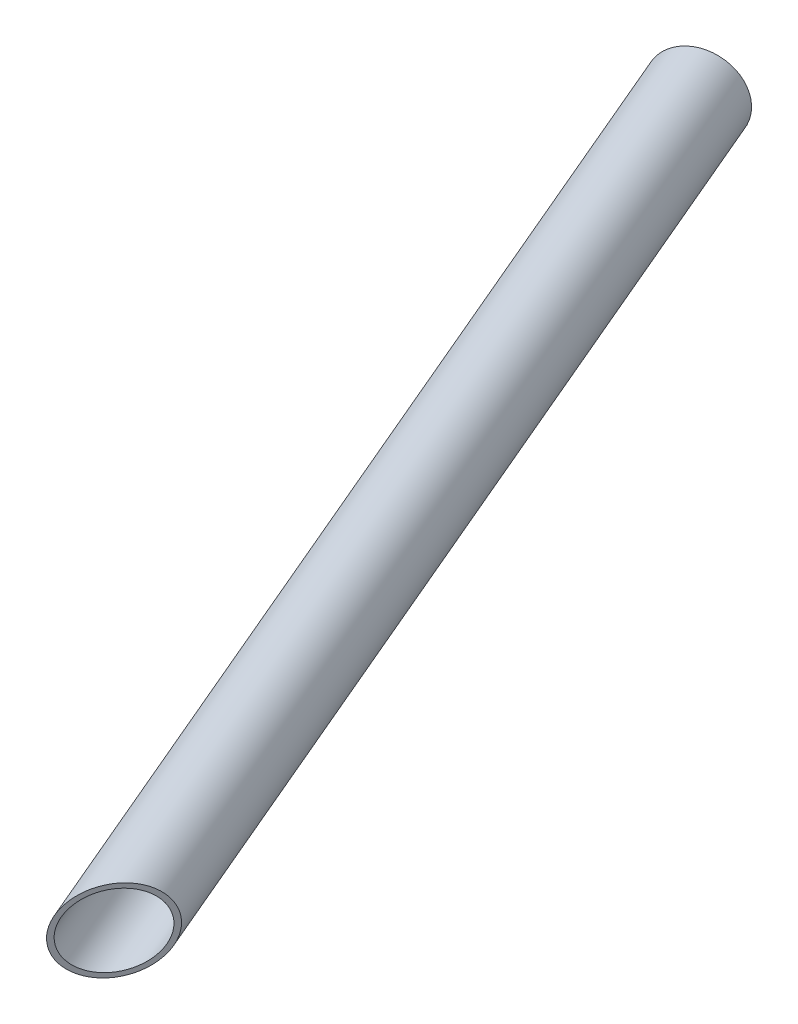
ISO-10303-21;
HEADER;
FILE_DESCRIPTION(('STEP AP214'),'2;1');
FILE_NAME('part.step','',(''),(''),'','','');
FILE_SCHEMA(('AUTOMOTIVE_DESIGN { 1 0 10303 214 1 1 1 1 }'));
ENDSEC;
DATA;
#1=APPLICATION_CONTEXT('core data for automotive mechanical design processes');
#2=APPLICATION_PROTOCOL_DEFINITION('international standard','automotive_design',2000,#1);
#3=PRODUCT_CONTEXT('',#1,'mechanical');
#4=PRODUCT('Part','Part','',(#3));
#5=PRODUCT_RELATED_PRODUCT_CATEGORY('part','',(#4));
#6=PRODUCT_DEFINITION_FORMATION('','',#4);
#7=PRODUCT_DEFINITION_CONTEXT('part definition',#1,'design');
#8=PRODUCT_DEFINITION('design','',#6,#7);
#9=PRODUCT_DEFINITION_SHAPE('','',#8);
#10=(LENGTH_UNIT() NAMED_UNIT(*) SI_UNIT(.MILLI.,.METRE.));
#11=(NAMED_UNIT(*) PLANE_ANGLE_UNIT() SI_UNIT($,.RADIAN.));
#12=(NAMED_UNIT(*) SI_UNIT($,.STERADIAN.) SOLID_ANGLE_UNIT());
#13=UNCERTAINTY_MEASURE_WITH_UNIT(LENGTH_MEASURE(1.E-05),#10,'distance_accuracy_value','');
#14=(GEOMETRIC_REPRESENTATION_CONTEXT(3) GLOBAL_UNCERTAINTY_ASSIGNED_CONTEXT((#13)) GLOBAL_UNIT_ASSIGNED_CONTEXT((#10,
#11,#12)) REPRESENTATION_CONTEXT('',''));
#15=CARTESIAN_POINT('',(0.,0.,0.));
#16=DIRECTION('',(0.,0.,1.));
#17=DIRECTION('',(1.,0.,0.));
#18=AXIS2_PLACEMENT_3D('',#15,#16,#17);
#19=CARTESIAN_POINT('',(-150.,0.,-200.));
#20=DIRECTION('',(0.391140640344852,0.,0.920330918458474));
#21=DIRECTION('',(0.920330918458475,0.,-0.391140640344852));
#22=AXIS2_PLACEMENT_3D('',#19,#20,#21);
#23=CYLINDRICAL_SURFACE('',#22,7.1);
#24=CARTESIAN_POINT('',(-150.,0.,-200.));
#25=DIRECTION('',(-0.391140640344852,0.,-0.920330918458475));
#26=DIRECTION('',(-0.920330918458475,0.,0.391140640344852));
#27=AXIS2_PLACEMENT_3D('',#24,#25,#26);
#28=CIRCLE('',#27,7.1);
#29=CARTESIAN_POINT('',(-156.534349521055,0.,-197.222901453552));
#30=VERTEX_POINT('',#29);
#31=EDGE_CURVE('E53',#30,#30,#28,.T.);
#32=ORIENTED_EDGE('',*,*,#31,.T.);
#33=EDGE_LOOP('',(#32));
#34=FACE_BOUND('',#33,.T.);
#35=CARTESIAN_POINT('',(-65.,0.,0.));
#36=DIRECTION('',(0.834008585191079,0.,0.551751465632466));
#37=DIRECTION('',(-0.551751465632466,0.,0.83400858519108));
#38=AXIS2_PLACEMENT_3D('',#35,#36,#37);
#39=ELLIPSE('',#38,8.51310181462139,7.1);
#40=CARTESIAN_POINT('',(-69.6971164032958,0.,7.1));
#41=VERTEX_POINT('',#40);
#42=EDGE_CURVE('E43',#41,#41,#39,.T.);
#43=ORIENTED_EDGE('',*,*,#42,.T.);
#44=EDGE_LOOP('',(#43));
#45=FACE_BOUND('',#44,.T.);
#46=ADVANCED_FACE('F39',(#34,#45),#23,.F.);
#47=CARTESIAN_POINT('',(-150.,0.,-200.));
#48=DIRECTION('',(0.391140640344852,0.,0.920330918458474));
#49=DIRECTION('',(0.920330918458475,0.,-0.391140640344852));
#50=AXIS2_PLACEMENT_3D('',#47,#48,#49);
#51=CYLINDRICAL_SURFACE('',#50,8.);
#52=CARTESIAN_POINT('',(-150.,0.,-200.));
#53=DIRECTION('',(-0.391140640344852,0.,-0.920330918458475));
#54=DIRECTION('',(-0.920330918458475,0.,0.391140640344852));
#55=AXIS2_PLACEMENT_3D('',#52,#53,#54);
#56=CIRCLE('',#55,8.);
#57=CARTESIAN_POINT('',(-157.362647347668,0.,-196.870874877241));
#58=VERTEX_POINT('',#57);
#59=EDGE_CURVE('E47',#58,#58,#56,.T.);
#60=ORIENTED_EDGE('',*,*,#59,.F.);
#61=EDGE_LOOP('',(#60));
#62=FACE_BOUND('',#61,.T.);
#63=CARTESIAN_POINT('',(-65.,0.,0.));
#64=DIRECTION('',(0.834008585191079,0.,0.551751465632466));
#65=DIRECTION('',(-0.551751465632466,0.,0.83400858519108));
#66=AXIS2_PLACEMENT_3D('',#63,#64,#65);
#67=ELLIPSE('',#66,9.59222739675651,8.);
#68=CARTESIAN_POINT('',(-70.2925255248403,0.,8.00000000000001));
#69=VERTEX_POINT('',#68);
#70=EDGE_CURVE('E10',#69,#69,#67,.T.);
#71=ORIENTED_EDGE('',*,*,#70,.F.);
#72=EDGE_LOOP('',(#71));
#73=FACE_BOUND('',#72,.T.);
#74=ADVANCED_FACE('F67',(#62,#73),#51,.T.);
#75=CARTESIAN_POINT('',(-150.,0.,-200.));
#76=DIRECTION('',(-0.391140640344852,0.,-0.920330918458475));
#77=DIRECTION('',(-0.920330918458475,0.,0.391140640344852));
#78=AXIS2_PLACEMENT_3D('',#75,#76,#77);
#79=PLANE('',#78);
#80=ORIENTED_EDGE('',*,*,#31,.F.);
#81=EDGE_LOOP('',(#80));
#82=FACE_BOUND('',#81,.T.);
#83=ORIENTED_EDGE('',*,*,#59,.T.);
#84=EDGE_LOOP('',(#83));
#85=FACE_BOUND('',#84,.T.);
#86=ADVANCED_FACE('F62',(#82,#85),#79,.T.);
#87=CARTESIAN_POINT('',(-65.,0.,0.));
#88=DIRECTION('',(0.834008585191079,0.,0.551751465632466));
#89=DIRECTION('',(0.551751465632466,0.,-0.83400858519108));
#90=AXIS2_PLACEMENT_3D('',#87,#88,#89);
#91=PLANE('',#90);
#92=ORIENTED_EDGE('',*,*,#42,.F.);
#93=EDGE_LOOP('',(#92));
#94=FACE_BOUND('',#93,.T.);
#95=ORIENTED_EDGE('',*,*,#70,.T.);
#96=EDGE_LOOP('',(#95));
#97=FACE_BOUND('',#96,.T.);
#98=ADVANCED_FACE('F41',(#94,#97),#91,.T.);
#99=CLOSED_SHELL('',(#46,#74,#86,#98));
#100=MANIFOLD_SOLID_BREP('B2',#99);
#101=ADVANCED_BREP_SHAPE_REPRESENTATION('',(#18,#100),#14);
#102=SHAPE_DEFINITION_REPRESENTATION(#9,#101);
ENDSEC;
END-ISO-10303-21;
